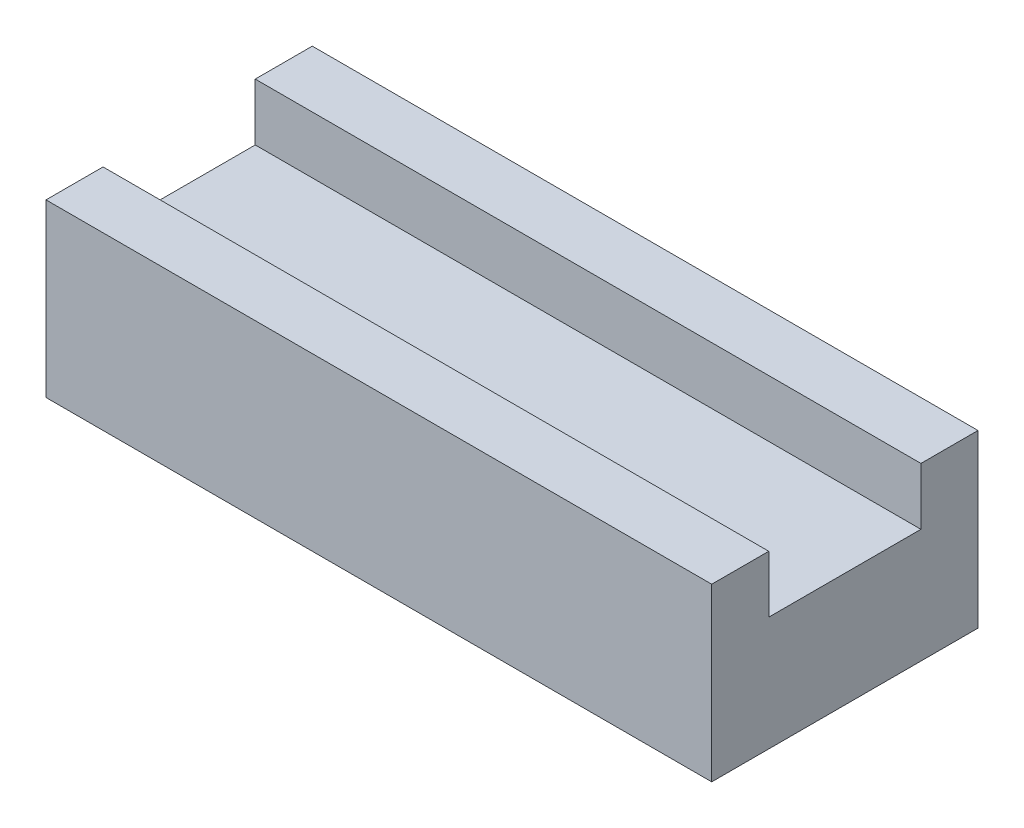
ISO-10303-21;
HEADER;
FILE_DESCRIPTION(('STEP AP214'),'2;1');
FILE_NAME('part.step','',(''),(''),'','','');
FILE_SCHEMA(('AUTOMOTIVE_DESIGN { 1 0 10303 214 1 1 1 1 }'));
ENDSEC;
DATA;
#1=APPLICATION_CONTEXT('core data for automotive mechanical design processes');
#2=APPLICATION_PROTOCOL_DEFINITION('international standard','automotive_design',2000,#1);
#3=PRODUCT_CONTEXT('',#1,'mechanical');
#4=PRODUCT('Part','Part','',(#3));
#5=PRODUCT_RELATED_PRODUCT_CATEGORY('part','',(#4));
#6=PRODUCT_DEFINITION_FORMATION('','',#4);
#7=PRODUCT_DEFINITION_CONTEXT('part definition',#1,'design');
#8=PRODUCT_DEFINITION('design','',#6,#7);
#9=PRODUCT_DEFINITION_SHAPE('','',#8);
#10=(LENGTH_UNIT() NAMED_UNIT(*) SI_UNIT(.MILLI.,.METRE.));
#11=(NAMED_UNIT(*) PLANE_ANGLE_UNIT() SI_UNIT($,.RADIAN.));
#12=(NAMED_UNIT(*) SI_UNIT($,.STERADIAN.) SOLID_ANGLE_UNIT());
#13=UNCERTAINTY_MEASURE_WITH_UNIT(LENGTH_MEASURE(1.E-05),#10,'distance_accuracy_value','');
#14=(GEOMETRIC_REPRESENTATION_CONTEXT(3) GLOBAL_UNCERTAINTY_ASSIGNED_CONTEXT((#13)) GLOBAL_UNIT_ASSIGNED_CONTEXT((#10,
#11,#12)) REPRESENTATION_CONTEXT('',''));
#15=CARTESIAN_POINT('',(0.,0.,0.));
#16=DIRECTION('',(0.,0.,1.));
#17=DIRECTION('',(1.,0.,0.));
#18=AXIS2_PLACEMENT_3D('',#15,#16,#17);
#19=CARTESIAN_POINT('',(-35.,-3.,-7.));
#20=DIRECTION('',(0.,0.,-1.));
#21=DIRECTION('',(0.,1.,0.));
#22=AXIS2_PLACEMENT_3D('',#19,#20,#21);
#23=PLANE('',#22);
#24=DIRECTION('',(0.,1.,0.));
#25=VECTOR('',#24,1.);
#26=CARTESIAN_POINT('',(0.,-3.,-7.));
#27=LINE('',#26,#25);
#28=CARTESIAN_POINT('',(0.,-3.,-7.));
#29=VERTEX_POINT('',#28);
#30=CARTESIAN_POINT('',(0.,6.,-7.));
#31=VERTEX_POINT('',#30);
#32=EDGE_CURVE('E152',#29,#31,#27,.T.);
#33=ORIENTED_EDGE('',*,*,#32,.F.);
#34=DIRECTION('',(1.,0.,0.));
#35=VECTOR('',#34,1.);
#36=CARTESIAN_POINT('',(-35.,-3.,-7.));
#37=LINE('',#36,#35);
#38=CARTESIAN_POINT('',(-35.,-3.,-7.));
#39=VERTEX_POINT('',#38);
#40=EDGE_CURVE('E11',#39,#29,#37,.T.);
#41=ORIENTED_EDGE('',*,*,#40,.F.);
#42=DIRECTION('',(0.,1.,0.));
#43=VECTOR('',#42,1.);
#44=CARTESIAN_POINT('',(-35.,3.,-7.));
#45=LINE('',#44,#43);
#46=CARTESIAN_POINT('',(-35.,6.,-7.));
#47=VERTEX_POINT('',#46);
#48=EDGE_CURVE('E55',#39,#47,#45,.T.);
#49=ORIENTED_EDGE('',*,*,#48,.T.);
#50=DIRECTION('',(1.,0.,0.));
#51=VECTOR('',#50,1.);
#52=CARTESIAN_POINT('',(-35.,6.,-7.));
#53=LINE('',#52,#51);
#54=EDGE_CURVE('E40',#47,#31,#53,.T.);
#55=ORIENTED_EDGE('',*,*,#54,.T.);
#56=EDGE_LOOP('',(#33,#41,#49,#55));
#57=FACE_BOUND('',#56,.T.);
#58=ADVANCED_FACE('F36',(#57),#23,.T.);
#59=CARTESIAN_POINT('',(-35.,-3.,7.));
#60=DIRECTION('',(0.,-1.,0.));
#61=DIRECTION('',(0.,0.,-1.));
#62=AXIS2_PLACEMENT_3D('',#59,#60,#61);
#63=PLANE('',#62);
#64=DIRECTION('',(0.,0.,-1.));
#65=VECTOR('',#64,1.);
#66=CARTESIAN_POINT('',(0.,-3.,7.));
#67=LINE('',#66,#65);
#68=CARTESIAN_POINT('',(0.,-3.,7.));
#69=VERTEX_POINT('',#68);
#70=EDGE_CURVE('E150',#69,#29,#67,.T.);
#71=ORIENTED_EDGE('',*,*,#70,.F.);
#72=DIRECTION('',(1.,0.,0.));
#73=VECTOR('',#72,1.);
#74=CARTESIAN_POINT('',(-35.,-3.,7.));
#75=LINE('',#74,#73);
#76=CARTESIAN_POINT('',(-35.,-3.,7.));
#77=VERTEX_POINT('',#76);
#78=EDGE_CURVE('E46',#77,#69,#75,.T.);
#79=ORIENTED_EDGE('',*,*,#78,.F.);
#80=DIRECTION('',(0.,0.,-1.));
#81=VECTOR('',#80,1.);
#82=CARTESIAN_POINT('',(-35.,-3.,7.));
#83=LINE('',#82,#81);
#84=EDGE_CURVE('E125',#77,#39,#83,.T.);
#85=ORIENTED_EDGE('',*,*,#84,.T.);
#86=ORIENTED_EDGE('',*,*,#40,.T.);
#87=EDGE_LOOP('',(#71,#79,#85,#86));
#88=FACE_BOUND('',#87,.T.);
#89=ADVANCED_FACE('F165',(#88),#63,.T.);
#90=CARTESIAN_POINT('',(-35.,-3.,7.));
#91=DIRECTION('',(0.,0.,1.));
#92=DIRECTION('',(0.,-1.,0.));
#93=AXIS2_PLACEMENT_3D('',#90,#91,#92);
#94=PLANE('',#93);
#95=DIRECTION('',(0.,-1.,0.));
#96=VECTOR('',#95,1.);
#97=CARTESIAN_POINT('',(0.,-3.,7.));
#98=LINE('',#97,#96);
#99=CARTESIAN_POINT('',(0.,6.,7.));
#100=VERTEX_POINT('',#99);
#101=EDGE_CURVE('E113',#100,#69,#98,.T.);
#102=ORIENTED_EDGE('',*,*,#101,.F.);
#103=DIRECTION('',(1.,0.,0.));
#104=VECTOR('',#103,1.);
#105=CARTESIAN_POINT('',(-35.,6.,7.));
#106=LINE('',#105,#104);
#107=CARTESIAN_POINT('',(-35.,6.,7.));
#108=VERTEX_POINT('',#107);
#109=EDGE_CURVE('E108',#108,#100,#106,.T.);
#110=ORIENTED_EDGE('',*,*,#109,.F.);
#111=DIRECTION('',(0.,-1.,0.));
#112=VECTOR('',#111,1.);
#113=CARTESIAN_POINT('',(-35.,3.,7.));
#114=LINE('',#113,#112);
#115=EDGE_CURVE('E111',#108,#77,#114,.T.);
#116=ORIENTED_EDGE('',*,*,#115,.T.);
#117=ORIENTED_EDGE('',*,*,#78,.T.);
#118=EDGE_LOOP('',(#102,#110,#116,#117));
#119=FACE_BOUND('',#118,.T.);
#120=ADVANCED_FACE('F110',(#119),#94,.T.);
#121=CARTESIAN_POINT('',(-35.,6.,7.));
#122=DIRECTION('',(0.,1.,0.));
#123=DIRECTION('',(0.,0.,1.));
#124=AXIS2_PLACEMENT_3D('',#121,#122,#123);
#125=PLANE('',#124);
#126=DIRECTION('',(0.,0.,1.));
#127=VECTOR('',#126,1.);
#128=CARTESIAN_POINT('',(0.,6.,7.));
#129=LINE('',#128,#127);
#130=CARTESIAN_POINT('',(0.,6.,4.));
#131=VERTEX_POINT('',#130);
#132=EDGE_CURVE('E147',#131,#100,#129,.T.);
#133=ORIENTED_EDGE('',*,*,#132,.F.);
#134=DIRECTION('',(1.,0.,0.));
#135=VECTOR('',#134,1.);
#136=CARTESIAN_POINT('',(-35.,6.,4.));
#137=LINE('',#136,#135);
#138=CARTESIAN_POINT('',(-35.,6.,4.));
#139=VERTEX_POINT('',#138);
#140=EDGE_CURVE('E118',#139,#131,#137,.T.);
#141=ORIENTED_EDGE('',*,*,#140,.F.);
#142=DIRECTION('',(0.,0.,1.));
#143=VECTOR('',#142,1.);
#144=CARTESIAN_POINT('',(-35.,6.,7.));
#145=LINE('',#144,#143);
#146=EDGE_CURVE('E123',#139,#108,#145,.T.);
#147=ORIENTED_EDGE('',*,*,#146,.T.);
#148=ORIENTED_EDGE('',*,*,#109,.T.);
#149=EDGE_LOOP('',(#133,#141,#147,#148));
#150=FACE_BOUND('',#149,.T.);
#151=ADVANCED_FACE('F127',(#150),#125,.T.);
#152=CARTESIAN_POINT('',(-35.,6.,4.));
#153=DIRECTION('',(0.,0.,-1.));
#154=DIRECTION('',(0.,1.,0.));
#155=AXIS2_PLACEMENT_3D('',#152,#153,#154);
#156=PLANE('',#155);
#157=DIRECTION('',(0.,1.,0.));
#158=VECTOR('',#157,1.);
#159=CARTESIAN_POINT('',(0.,6.,4.));
#160=LINE('',#159,#158);
#161=CARTESIAN_POINT('',(0.,3.,4.));
#162=VERTEX_POINT('',#161);
#163=EDGE_CURVE('E144',#162,#131,#160,.T.);
#164=ORIENTED_EDGE('',*,*,#163,.F.);
#165=DIRECTION('',(1.,0.,0.));
#166=VECTOR('',#165,1.);
#167=CARTESIAN_POINT('',(-35.,3.,4.));
#168=LINE('',#167,#166);
#169=CARTESIAN_POINT('',(-35.,3.,4.));
#170=VERTEX_POINT('',#169);
#171=EDGE_CURVE('E156',#170,#162,#168,.T.);
#172=ORIENTED_EDGE('',*,*,#171,.F.);
#173=DIRECTION('',(0.,1.,0.));
#174=VECTOR('',#173,1.);
#175=CARTESIAN_POINT('',(-35.,6.,4.));
#176=LINE('',#175,#174);
#177=EDGE_CURVE('E128',#170,#139,#176,.T.);
#178=ORIENTED_EDGE('',*,*,#177,.T.);
#179=ORIENTED_EDGE('',*,*,#140,.T.);
#180=EDGE_LOOP('',(#164,#172,#178,#179));
#181=FACE_BOUND('',#180,.T.);
#182=ADVANCED_FACE('F178',(#181),#156,.T.);
#183=CARTESIAN_POINT('',(-35.,3.,4.));
#184=DIRECTION('',(0.,1.,0.));
#185=DIRECTION('',(0.,0.,1.));
#186=AXIS2_PLACEMENT_3D('',#183,#184,#185);
#187=PLANE('',#186);
#188=DIRECTION('',(0.,0.,1.));
#189=VECTOR('',#188,1.);
#190=CARTESIAN_POINT('',(0.,3.,4.));
#191=LINE('',#190,#189);
#192=CARTESIAN_POINT('',(0.,3.,-4.));
#193=VERTEX_POINT('',#192);
#194=EDGE_CURVE('E141',#193,#162,#191,.T.);
#195=ORIENTED_EDGE('',*,*,#194,.F.);
#196=DIRECTION('',(1.,0.,0.));
#197=VECTOR('',#196,1.);
#198=CARTESIAN_POINT('',(-35.,3.,-4.));
#199=LINE('',#198,#197);
#200=CARTESIAN_POINT('',(-35.,3.,-4.));
#201=VERTEX_POINT('',#200);
#202=EDGE_CURVE('E158',#201,#193,#199,.T.);
#203=ORIENTED_EDGE('',*,*,#202,.F.);
#204=DIRECTION('',(0.,0.,1.));
#205=VECTOR('',#204,1.);
#206=CARTESIAN_POINT('',(-35.,3.,4.));
#207=LINE('',#206,#205);
#208=EDGE_CURVE('E130',#201,#170,#207,.T.);
#209=ORIENTED_EDGE('',*,*,#208,.T.);
#210=ORIENTED_EDGE('',*,*,#171,.T.);
#211=EDGE_LOOP('',(#195,#203,#209,#210));
#212=FACE_BOUND('',#211,.T.);
#213=ADVANCED_FACE('F181',(#212),#187,.T.);
#214=CARTESIAN_POINT('',(-35.,6.,-4.));
#215=DIRECTION('',(0.,0.,1.));
#216=DIRECTION('',(0.,-1.,0.));
#217=AXIS2_PLACEMENT_3D('',#214,#215,#216);
#218=PLANE('',#217);
#219=DIRECTION('',(0.,-1.,0.));
#220=VECTOR('',#219,1.);
#221=CARTESIAN_POINT('',(0.,6.,-4.));
#222=LINE('',#221,#220);
#223=CARTESIAN_POINT('',(0.,6.,-4.));
#224=VERTEX_POINT('',#223);
#225=EDGE_CURVE('E138',#224,#193,#222,.T.);
#226=ORIENTED_EDGE('',*,*,#225,.F.);
#227=DIRECTION('',(1.,0.,0.));
#228=VECTOR('',#227,1.);
#229=CARTESIAN_POINT('',(-35.,6.,-4.));
#230=LINE('',#229,#228);
#231=CARTESIAN_POINT('',(-35.,6.,-4.));
#232=VERTEX_POINT('',#231);
#233=EDGE_CURVE('E159',#232,#224,#230,.T.);
#234=ORIENTED_EDGE('',*,*,#233,.F.);
#235=DIRECTION('',(0.,-1.,0.));
#236=VECTOR('',#235,1.);
#237=CARTESIAN_POINT('',(-35.,6.,-4.));
#238=LINE('',#237,#236);
#239=EDGE_CURVE('E194',#232,#201,#238,.T.);
#240=ORIENTED_EDGE('',*,*,#239,.T.);
#241=ORIENTED_EDGE('',*,*,#202,.T.);
#242=EDGE_LOOP('',(#226,#234,#240,#241));
#243=FACE_BOUND('',#242,.T.);
#244=ADVANCED_FACE('F184',(#243),#218,.T.);
#245=CARTESIAN_POINT('',(-35.,6.,-7.));
#246=DIRECTION('',(0.,1.,0.));
#247=DIRECTION('',(0.,0.,1.));
#248=AXIS2_PLACEMENT_3D('',#245,#246,#247);
#249=PLANE('',#248);
#250=DIRECTION('',(0.,0.,1.));
#251=VECTOR('',#250,1.);
#252=CARTESIAN_POINT('',(0.,6.,-7.));
#253=LINE('',#252,#251);
#254=EDGE_CURVE('E135',#31,#224,#253,.T.);
#255=ORIENTED_EDGE('',*,*,#254,.F.);
#256=ORIENTED_EDGE('',*,*,#54,.F.);
#257=DIRECTION('',(0.,0.,1.));
#258=VECTOR('',#257,1.);
#259=CARTESIAN_POINT('',(-35.,6.,-7.));
#260=LINE('',#259,#258);
#261=EDGE_CURVE('E198',#47,#232,#260,.T.);
#262=ORIENTED_EDGE('',*,*,#261,.T.);
#263=ORIENTED_EDGE('',*,*,#233,.T.);
#264=EDGE_LOOP('',(#255,#256,#262,#263));
#265=FACE_BOUND('',#264,.T.);
#266=ADVANCED_FACE('F38',(#265),#249,.T.);
#267=CARTESIAN_POINT('',(-35.,0.,0.));
#268=DIRECTION('',(1.,0.,0.));
#269=DIRECTION('',(0.,0.,-1.));
#270=AXIS2_PLACEMENT_3D('',#267,#268,#269);
#271=PLANE('',#270);
#272=ORIENTED_EDGE('',*,*,#48,.F.);
#273=ORIENTED_EDGE('',*,*,#84,.F.);
#274=ORIENTED_EDGE('',*,*,#115,.F.);
#275=ORIENTED_EDGE('',*,*,#146,.F.);
#276=ORIENTED_EDGE('',*,*,#177,.F.);
#277=ORIENTED_EDGE('',*,*,#208,.F.);
#278=ORIENTED_EDGE('',*,*,#239,.F.);
#279=ORIENTED_EDGE('',*,*,#261,.F.);
#280=EDGE_LOOP('',(#272,#273,#274,#275,#276,#277,#278,#279));
#281=FACE_BOUND('',#280,.T.);
#282=ADVANCED_FACE('F121',(#281),#271,.F.);
#283=CARTESIAN_POINT('',(0.,0.,0.));
#284=DIRECTION('',(1.,0.,0.));
#285=DIRECTION('',(0.,0.,-1.));
#286=AXIS2_PLACEMENT_3D('',#283,#284,#285);
#287=PLANE('',#286);
#288=ORIENTED_EDGE('',*,*,#32,.T.);
#289=ORIENTED_EDGE('',*,*,#254,.T.);
#290=ORIENTED_EDGE('',*,*,#225,.T.);
#291=ORIENTED_EDGE('',*,*,#194,.T.);
#292=ORIENTED_EDGE('',*,*,#163,.T.);
#293=ORIENTED_EDGE('',*,*,#132,.T.);
#294=ORIENTED_EDGE('',*,*,#101,.T.);
#295=ORIENTED_EDGE('',*,*,#70,.T.);
#296=EDGE_LOOP('',(#288,#289,#290,#291,#292,#293,#294,#295));
#297=FACE_BOUND('',#296,.T.);
#298=ADVANCED_FACE('F164',(#297),#287,.T.);
#299=CLOSED_SHELL('',(#58,#89,#120,#151,#182,#213,#244,#266,#282,#298));
#300=MANIFOLD_SOLID_BREP('B2',#299);
#301=ADVANCED_BREP_SHAPE_REPRESENTATION('',(#18,#300),#14);
#302=SHAPE_DEFINITION_REPRESENTATION(#9,#301);
ENDSEC;
END-ISO-10303-21;
